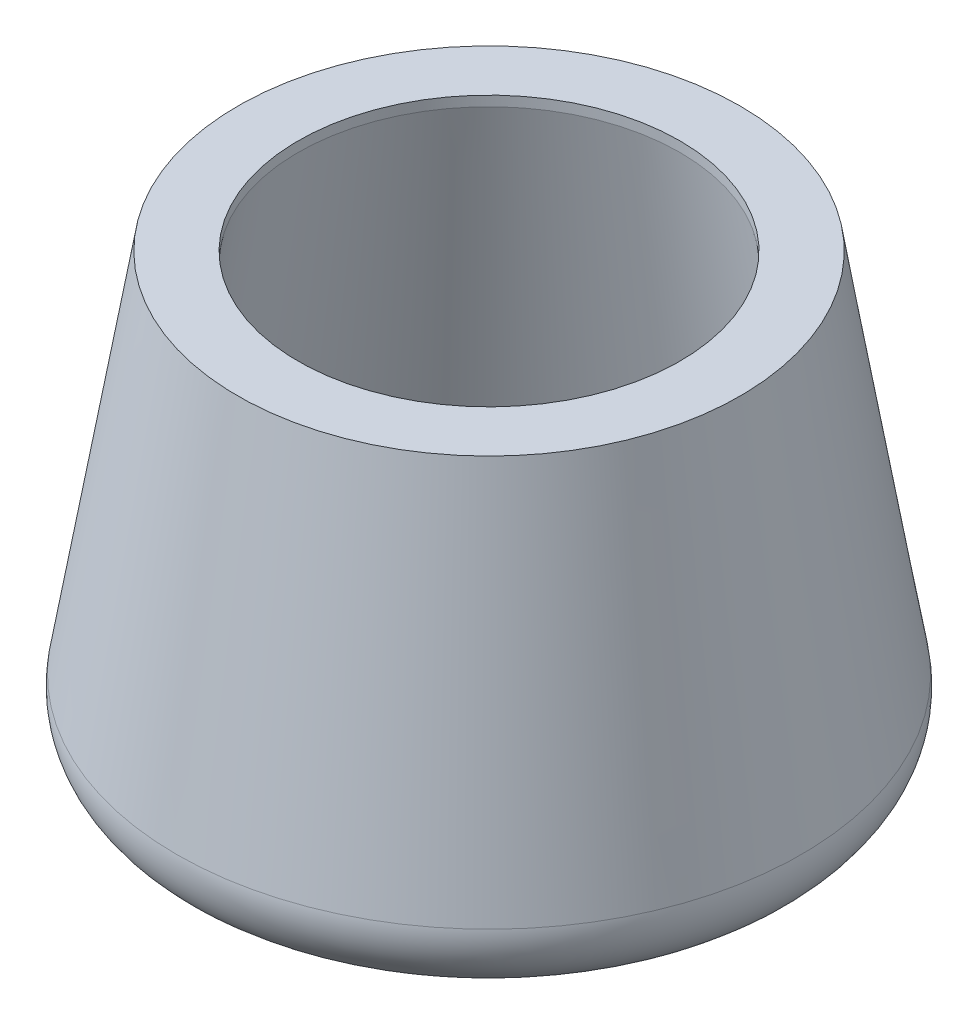
ISO-10303-21;
HEADER;
FILE_DESCRIPTION(('STEP AP214'),'2;1');
FILE_NAME('part.step','',(''),(''),'','','');
FILE_SCHEMA(('AUTOMOTIVE_DESIGN { 1 0 10303 214 1 1 1 1 }'));
ENDSEC;
DATA;
#1=APPLICATION_CONTEXT('core data for automotive mechanical design processes');
#2=APPLICATION_PROTOCOL_DEFINITION('international standard','automotive_design',2000,#1);
#3=PRODUCT_CONTEXT('',#1,'mechanical');
#4=PRODUCT('Part','Part','',(#3));
#5=PRODUCT_RELATED_PRODUCT_CATEGORY('part','',(#4));
#6=PRODUCT_DEFINITION_FORMATION('','',#4);
#7=PRODUCT_DEFINITION_CONTEXT('part definition',#1,'design');
#8=PRODUCT_DEFINITION('design','',#6,#7);
#9=PRODUCT_DEFINITION_SHAPE('','',#8);
#10=(LENGTH_UNIT() NAMED_UNIT(*) SI_UNIT(.MILLI.,.METRE.));
#11=(NAMED_UNIT(*) PLANE_ANGLE_UNIT() SI_UNIT($,.RADIAN.));
#12=(NAMED_UNIT(*) SI_UNIT($,.STERADIAN.) SOLID_ANGLE_UNIT());
#13=UNCERTAINTY_MEASURE_WITH_UNIT(LENGTH_MEASURE(1.E-05),#10,'distance_accuracy_value','');
#14=(GEOMETRIC_REPRESENTATION_CONTEXT(3) GLOBAL_UNCERTAINTY_ASSIGNED_CONTEXT((#13)) GLOBAL_UNIT_ASSIGNED_CONTEXT((#10,
#11,#12)) REPRESENTATION_CONTEXT('',''));
#15=CARTESIAN_POINT('',(0.,0.,0.));
#16=DIRECTION('',(0.,0.,1.));
#17=DIRECTION('',(1.,0.,0.));
#18=AXIS2_PLACEMENT_3D('',#15,#16,#17);
#19=CARTESIAN_POINT('',(0.,0.,0.));
#20=DIRECTION('',(0.,-1.,0.));
#21=DIRECTION('',(0.,0.,-1.));
#22=AXIS2_PLACEMENT_3D('',#19,#20,#21);
#23=TOROIDAL_SURFACE('',#22,10.4775,2.54);
#24=CARTESIAN_POINT('',(0.,-2.54,0.));
#25=DIRECTION('',(0.,-1.,0.));
#26=DIRECTION('',(0.,0.,-1.));
#27=AXIS2_PLACEMENT_3D('',#24,#25,#26);
#28=CIRCLE('',#27,10.4775);
#29=CARTESIAN_POINT('',(0.,-2.54,-10.4775));
#30=VERTEX_POINT('',#29);
#31=EDGE_CURVE('E72',#30,#30,#28,.T.);
#32=ORIENTED_EDGE('',*,*,#31,.F.);
#33=EDGE_LOOP('',(#32));
#34=FACE_BOUND('',#33,.T.);
#35=CARTESIAN_POINT('',(0.,0.417573427755607,0.));
#36=DIRECTION('',(0.,-1.,0.));
#37=DIRECTION('',(0.,0.,-1.));
#38=AXIS2_PLACEMENT_3D('',#35,#36,#37);
#39=CIRCLE('',#38,12.9829405665336);
#40=CARTESIAN_POINT('',(0.,0.417573427755607,-12.9829405665336));
#41=VERTEX_POINT('',#40);
#42=EDGE_CURVE('E10',#41,#41,#39,.T.);
#43=ORIENTED_EDGE('',*,*,#42,.T.);
#44=EDGE_LOOP('',(#43));
#45=FACE_BOUND('',#44,.T.);
#46=ADVANCED_FACE('F45',(#34,#45),#23,.T.);
#47=CARTESIAN_POINT('',(0.,15.6575734277556,0.));
#48=DIRECTION('',(0.,-1.,0.));
#49=DIRECTION('',(0.,0.,-1.));
#50=AXIS2_PLACEMENT_3D('',#47,#48,#49);
#51=CONICAL_SURFACE('',#50,10.4429405665336,0.165148677414627);
#52=ORIENTED_EDGE('',*,*,#42,.F.);
#53=EDGE_LOOP('',(#52));
#54=FACE_BOUND('',#53,.T.);
#55=CARTESIAN_POINT('',(0.,15.6575734277556,0.));
#56=DIRECTION('',(0.,-1.,0.));
#57=DIRECTION('',(0.,0.,-1.));
#58=AXIS2_PLACEMENT_3D('',#55,#56,#57);
#59=CIRCLE('',#58,10.4429405665336);
#60=CARTESIAN_POINT('',(0.,15.6575734277556,-10.4429405665336));
#61=VERTEX_POINT('',#60);
#62=EDGE_CURVE('E52',#61,#61,#59,.T.);
#63=ORIENTED_EDGE('',*,*,#62,.T.);
#64=EDGE_LOOP('',(#63));
#65=FACE_BOUND('',#64,.T.);
#66=ADVANCED_FACE('F80',(#54,#65),#51,.T.);
#67=CARTESIAN_POINT('',(0.,15.6575734277556,0.));
#68=DIRECTION('',(0.,1.,0.));
#69=DIRECTION('',(0.,0.,1.));
#70=AXIS2_PLACEMENT_3D('',#67,#68,#69);
#71=PLANE('',#70);
#72=CARTESIAN_POINT('',(0.,15.6575734277556,0.));
#73=DIRECTION('',(0.,-1.,0.));
#74=DIRECTION('',(0.,0.,-1.));
#75=AXIS2_PLACEMENT_3D('',#72,#73,#74);
#76=CIRCLE('',#75,7.9375);
#77=CARTESIAN_POINT('',(0.,15.6575734277556,-7.9375));
#78=VERTEX_POINT('',#77);
#79=EDGE_CURVE('E57',#78,#78,#76,.T.);
#80=ORIENTED_EDGE('',*,*,#79,.T.);
#81=EDGE_LOOP('',(#80));
#82=FACE_BOUND('',#81,.T.);
#83=ORIENTED_EDGE('',*,*,#62,.F.);
#84=EDGE_LOOP('',(#83));
#85=FACE_BOUND('',#84,.T.);
#86=ADVANCED_FACE('F84',(#82,#85),#71,.T.);
#87=CARTESIAN_POINT('',(0.,0.,0.));
#88=DIRECTION('',(0.,-1.,0.));
#89=DIRECTION('',(0.,0.,-1.));
#90=AXIS2_PLACEMENT_3D('',#87,#88,#89);
#91=CYLINDRICAL_SURFACE('',#90,7.9375);
#92=CARTESIAN_POINT('',(0.,15.24,0.));
#93=DIRECTION('',(0.,-1.,0.));
#94=DIRECTION('',(0.,0.,-1.));
#95=AXIS2_PLACEMENT_3D('',#92,#93,#94);
#96=CIRCLE('',#95,7.9375);
#97=CARTESIAN_POINT('',(0.,15.24,-7.9375));
#98=VERTEX_POINT('',#97);
#99=EDGE_CURVE('E62',#98,#98,#96,.T.);
#100=ORIENTED_EDGE('',*,*,#99,.T.);
#101=EDGE_LOOP('',(#100));
#102=FACE_BOUND('',#101,.T.);
#103=ORIENTED_EDGE('',*,*,#79,.F.);
#104=EDGE_LOOP('',(#103));
#105=FACE_BOUND('',#104,.T.);
#106=ADVANCED_FACE('F89',(#102,#105),#91,.F.);
#107=CARTESIAN_POINT('',(0.,15.24,0.));
#108=DIRECTION('',(0.,-1.,0.));
#109=DIRECTION('',(0.,0.,-1.));
#110=AXIS2_PLACEMENT_3D('',#107,#108,#109);
#111=CONICAL_SURFACE('',#110,7.9375,0.165148677414627);
#112=CARTESIAN_POINT('',(0.,0.,0.));
#113=DIRECTION('',(0.,-1.,0.));
#114=DIRECTION('',(0.,0.,-1.));
#115=AXIS2_PLACEMENT_3D('',#112,#113,#114);
#116=CIRCLE('',#115,10.4775);
#117=CARTESIAN_POINT('',(0.,0.,-10.4775));
#118=VERTEX_POINT('',#117);
#119=EDGE_CURVE('E68',#118,#118,#116,.T.);
#120=ORIENTED_EDGE('',*,*,#119,.T.);
#121=EDGE_LOOP('',(#120));
#122=FACE_BOUND('',#121,.T.);
#123=ORIENTED_EDGE('',*,*,#99,.F.);
#124=EDGE_LOOP('',(#123));
#125=FACE_BOUND('',#124,.T.);
#126=ADVANCED_FACE('F95',(#122,#125),#111,.F.);
#127=CARTESIAN_POINT('',(0.,0.,0.));
#128=DIRECTION('',(0.,1.,0.));
#129=DIRECTION('',(0.,0.,1.));
#130=AXIS2_PLACEMENT_3D('',#127,#128,#129);
#131=PLANE('',#130);
#132=ORIENTED_EDGE('',*,*,#119,.F.);
#133=EDGE_LOOP('',(#132));
#134=FACE_BOUND('',#133,.T.);
#135=ADVANCED_FACE('F99',(#134),#131,.T.);
#136=CARTESIAN_POINT('',(0.,-2.54,0.));
#137=DIRECTION('',(0.,1.,0.));
#138=DIRECTION('',(0.,0.,1.));
#139=AXIS2_PLACEMENT_3D('',#136,#137,#138);
#140=PLANE('',#139);
#141=ORIENTED_EDGE('',*,*,#31,.T.);
#142=EDGE_LOOP('',(#141));
#143=FACE_BOUND('',#142,.T.);
#144=ADVANCED_FACE('F77',(#143),#140,.F.);
#145=CLOSED_SHELL('',(#46,#66,#86,#106,#126,#135,#144));
#146=MANIFOLD_SOLID_BREP('B2',#145);
#147=ADVANCED_BREP_SHAPE_REPRESENTATION('',(#18,#146),#14);
#148=SHAPE_DEFINITION_REPRESENTATION(#9,#147);
ENDSEC;
END-ISO-10303-21;
